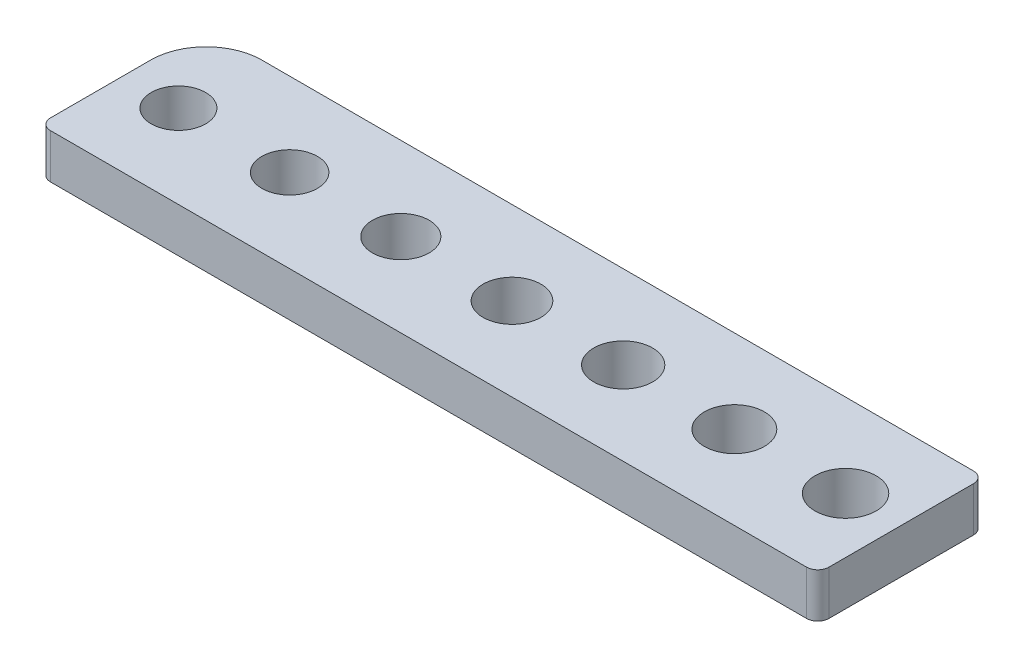
ISO-10303-21;
HEADER;
FILE_DESCRIPTION(('STEP AP214'),'2;1');
FILE_NAME('part.step','',(''),(''),'','','');
FILE_SCHEMA(('AUTOMOTIVE_DESIGN { 1 0 10303 214 1 1 1 1 }'));
ENDSEC;
DATA;
#1=APPLICATION_CONTEXT('core data for automotive mechanical design processes');
#2=APPLICATION_PROTOCOL_DEFINITION('international standard','automotive_design',2000,#1);
#3=PRODUCT_CONTEXT('',#1,'mechanical');
#4=PRODUCT('Part','Part','',(#3));
#5=PRODUCT_RELATED_PRODUCT_CATEGORY('part','',(#4));
#6=PRODUCT_DEFINITION_FORMATION('','',#4);
#7=PRODUCT_DEFINITION_CONTEXT('part definition',#1,'design');
#8=PRODUCT_DEFINITION('design','',#6,#7);
#9=PRODUCT_DEFINITION_SHAPE('','',#8);
#10=(LENGTH_UNIT() NAMED_UNIT(*) SI_UNIT(.MILLI.,.METRE.));
#11=(NAMED_UNIT(*) PLANE_ANGLE_UNIT() SI_UNIT($,.RADIAN.));
#12=(NAMED_UNIT(*) SI_UNIT($,.STERADIAN.) SOLID_ANGLE_UNIT());
#13=UNCERTAINTY_MEASURE_WITH_UNIT(LENGTH_MEASURE(1.E-05),#10,'distance_accuracy_value','');
#14=(GEOMETRIC_REPRESENTATION_CONTEXT(3) GLOBAL_UNCERTAINTY_ASSIGNED_CONTEXT((#13)) GLOBAL_UNIT_ASSIGNED_CONTEXT((#10,
#11,#12)) REPRESENTATION_CONTEXT('',''));
#15=CARTESIAN_POINT('',(0.,0.,0.));
#16=DIRECTION('',(0.,0.,1.));
#17=DIRECTION('',(1.,0.,0.));
#18=AXIS2_PLACEMENT_3D('',#15,#16,#17);
#19=CARTESIAN_POINT('',(0.,4.,0.));
#20=DIRECTION('',(0.,-1.,0.));
#21=DIRECTION('',(0.,0.,-1.));
#22=AXIS2_PLACEMENT_3D('',#19,#20,#21);
#23=PLANE('',#22);
#24=DIRECTION('',(0.,0.,-1.));
#25=VECTOR('',#24,1.);
#26=CARTESIAN_POINT('',(35.,4.,7.5));
#27=LINE('',#26,#25);
#28=CARTESIAN_POINT('',(35.,4.,6.5));
#29=VERTEX_POINT('',#28);
#30=CARTESIAN_POINT('',(35.,4.,-6.5));
#31=VERTEX_POINT('',#30);
#32=EDGE_CURVE('E125',#29,#31,#27,.T.);
#33=ORIENTED_EDGE('',*,*,#32,.T.);
#34=CARTESIAN_POINT('',(34.,4.,-6.5));
#35=DIRECTION('',(0.,-1.,0.));
#36=DIRECTION('',(0.,0.,-1.));
#37=AXIS2_PLACEMENT_3D('',#34,#35,#36);
#38=CIRCLE('',#37,1.);
#39=CARTESIAN_POINT('',(34.,4.,-7.5));
#40=VERTEX_POINT('',#39);
#41=EDGE_CURVE('E150',#31,#40,#38,.F.);
#42=ORIENTED_EDGE('',*,*,#41,.T.);
#43=DIRECTION('',(-1.,0.,0.));
#44=VECTOR('',#43,1.);
#45=CARTESIAN_POINT('',(-35.,4.,-7.5));
#46=LINE('',#45,#44);
#47=CARTESIAN_POINT('',(-30.,4.,-7.5));
#48=VERTEX_POINT('',#47);
#49=EDGE_CURVE('E169',#40,#48,#46,.T.);
#50=ORIENTED_EDGE('',*,*,#49,.T.);
#51=CARTESIAN_POINT('',(-30.,4.,-2.5));
#52=DIRECTION('',(0.,-1.,0.));
#53=DIRECTION('',(0.,0.,-1.));
#54=AXIS2_PLACEMENT_3D('',#51,#52,#53);
#55=CIRCLE('',#54,5.);
#56=CARTESIAN_POINT('',(-35.,4.,-2.5));
#57=VERTEX_POINT('',#56);
#58=EDGE_CURVE('E132',#48,#57,#55,.F.);
#59=ORIENTED_EDGE('',*,*,#58,.T.);
#60=DIRECTION('',(0.,0.,1.));
#61=VECTOR('',#60,1.);
#62=CARTESIAN_POINT('',(-35.,4.,7.5));
#63=LINE('',#62,#61);
#64=CARTESIAN_POINT('',(-35.,4.,6.5));
#65=VERTEX_POINT('',#64);
#66=EDGE_CURVE('E115',#57,#65,#63,.T.);
#67=ORIENTED_EDGE('',*,*,#66,.T.);
#68=CARTESIAN_POINT('',(-34.,4.,6.5));
#69=DIRECTION('',(0.,-1.,0.));
#70=DIRECTION('',(0.,0.,-1.));
#71=AXIS2_PLACEMENT_3D('',#68,#69,#70);
#72=CIRCLE('',#71,1.);
#73=CARTESIAN_POINT('',(-34.,4.,7.5));
#74=VERTEX_POINT('',#73);
#75=EDGE_CURVE('E53',#65,#74,#72,.F.);
#76=ORIENTED_EDGE('',*,*,#75,.T.);
#77=DIRECTION('',(1.,0.,0.));
#78=VECTOR('',#77,1.);
#79=CARTESIAN_POINT('',(-35.,4.,7.5));
#80=LINE('',#79,#78);
#81=CARTESIAN_POINT('',(34.,4.,7.5));
#82=VERTEX_POINT('',#81);
#83=EDGE_CURVE('E116',#74,#82,#80,.T.);
#84=ORIENTED_EDGE('',*,*,#83,.T.);
#85=CARTESIAN_POINT('',(34.,4.,6.5));
#86=DIRECTION('',(0.,-1.,0.));
#87=DIRECTION('',(0.,0.,-1.));
#88=AXIS2_PLACEMENT_3D('',#85,#86,#87);
#89=CIRCLE('',#88,1.);
#90=EDGE_CURVE('E148',#82,#29,#89,.F.);
#91=ORIENTED_EDGE('',*,*,#90,.T.);
#92=EDGE_LOOP('',(#33,#42,#50,#59,#67,#76,#84,#91));
#93=FACE_BOUND('',#92,.T.);
#94=CARTESIAN_POINT('',(-30.,4.,0.));
#95=DIRECTION('',(0.,1.,0.));
#96=DIRECTION('',(0.,0.,1.));
#97=AXIS2_PLACEMENT_3D('',#94,#95,#96);
#98=CIRCLE('',#97,2.45);
#99=CARTESIAN_POINT('',(-30.,4.,2.45));
#100=VERTEX_POINT('',#99);
#101=EDGE_CURVE('E177',#100,#100,#98,.T.);
#102=ORIENTED_EDGE('',*,*,#101,.F.);
#103=EDGE_LOOP('',(#102));
#104=FACE_BOUND('',#103,.T.);
#105=CARTESIAN_POINT('',(-20.,4.,0.));
#106=DIRECTION('',(0.,1.,0.));
#107=DIRECTION('',(0.,0.,1.));
#108=AXIS2_PLACEMENT_3D('',#105,#106,#107);
#109=CIRCLE('',#108,2.5);
#110=CARTESIAN_POINT('',(-20.,4.,2.5));
#111=VERTEX_POINT('',#110);
#112=EDGE_CURVE('E182',#111,#111,#109,.T.);
#113=ORIENTED_EDGE('',*,*,#112,.F.);
#114=EDGE_LOOP('',(#113));
#115=FACE_BOUND('',#114,.T.);
#116=CARTESIAN_POINT('',(-10.,4.,0.));
#117=DIRECTION('',(0.,1.,0.));
#118=DIRECTION('',(0.,0.,1.));
#119=AXIS2_PLACEMENT_3D('',#116,#117,#118);
#120=CIRCLE('',#119,2.55);
#121=CARTESIAN_POINT('',(-10.,4.,2.55));
#122=VERTEX_POINT('',#121);
#123=EDGE_CURVE('E187',#122,#122,#120,.T.);
#124=ORIENTED_EDGE('',*,*,#123,.F.);
#125=EDGE_LOOP('',(#124));
#126=FACE_BOUND('',#125,.T.);
#127=CARTESIAN_POINT('',(0.,4.,0.));
#128=DIRECTION('',(0.,1.,0.));
#129=DIRECTION('',(0.,0.,1.));
#130=AXIS2_PLACEMENT_3D('',#127,#128,#129);
#131=CIRCLE('',#130,2.6);
#132=CARTESIAN_POINT('',(0.,4.,2.6));
#133=VERTEX_POINT('',#132);
#134=EDGE_CURVE('E193',#133,#133,#131,.T.);
#135=ORIENTED_EDGE('',*,*,#134,.F.);
#136=EDGE_LOOP('',(#135));
#137=FACE_BOUND('',#136,.T.);
#138=CARTESIAN_POINT('',(10.,4.,0.));
#139=DIRECTION('',(0.,1.,0.));
#140=DIRECTION('',(0.,0.,1.));
#141=AXIS2_PLACEMENT_3D('',#138,#139,#140);
#142=CIRCLE('',#141,2.65);
#143=CARTESIAN_POINT('',(10.,4.,2.65));
#144=VERTEX_POINT('',#143);
#145=EDGE_CURVE('E199',#144,#144,#142,.T.);
#146=ORIENTED_EDGE('',*,*,#145,.F.);
#147=EDGE_LOOP('',(#146));
#148=FACE_BOUND('',#147,.T.);
#149=CARTESIAN_POINT('',(20.,4.,0.));
#150=DIRECTION('',(0.,1.,0.));
#151=DIRECTION('',(0.,0.,1.));
#152=AXIS2_PLACEMENT_3D('',#149,#150,#151);
#153=CIRCLE('',#152,2.7);
#154=CARTESIAN_POINT('',(20.,4.,2.7));
#155=VERTEX_POINT('',#154);
#156=EDGE_CURVE('E205',#155,#155,#153,.T.);
#157=ORIENTED_EDGE('',*,*,#156,.F.);
#158=EDGE_LOOP('',(#157));
#159=FACE_BOUND('',#158,.T.);
#160=CARTESIAN_POINT('',(30.,4.,0.));
#161=DIRECTION('',(0.,1.,0.));
#162=DIRECTION('',(0.,0.,1.));
#163=AXIS2_PLACEMENT_3D('',#160,#161,#162);
#164=CIRCLE('',#163,2.75);
#165=CARTESIAN_POINT('',(30.,4.,2.75));
#166=VERTEX_POINT('',#165);
#167=EDGE_CURVE('E211',#166,#166,#164,.T.);
#168=ORIENTED_EDGE('',*,*,#167,.F.);
#169=EDGE_LOOP('',(#168));
#170=FACE_BOUND('',#169,.T.);
#171=ADVANCED_FACE('F32',(#93,#104,#115,#126,#137,#148,#159,#170),#23,.F.);
#172=CARTESIAN_POINT('',(0.,0.,0.));
#173=DIRECTION('',(0.,-1.,0.));
#174=DIRECTION('',(0.,0.,-1.));
#175=AXIS2_PLACEMENT_3D('',#172,#173,#174);
#176=PLANE('',#175);
#177=CARTESIAN_POINT('',(20.,0.,0.));
#178=DIRECTION('',(0.,1.,0.));
#179=DIRECTION('',(0.,0.,1.));
#180=AXIS2_PLACEMENT_3D('',#177,#178,#179);
#181=CIRCLE('',#180,2.7);
#182=CARTESIAN_POINT('',(20.,0.,2.7));
#183=VERTEX_POINT('',#182);
#184=EDGE_CURVE('E208',#183,#183,#181,.T.);
#185=ORIENTED_EDGE('',*,*,#184,.T.);
#186=EDGE_LOOP('',(#185));
#187=FACE_BOUND('',#186,.T.);
#188=CARTESIAN_POINT('',(0.,0.,0.));
#189=DIRECTION('',(0.,1.,0.));
#190=DIRECTION('',(0.,0.,1.));
#191=AXIS2_PLACEMENT_3D('',#188,#189,#190);
#192=CIRCLE('',#191,2.6);
#193=CARTESIAN_POINT('',(0.,0.,2.6));
#194=VERTEX_POINT('',#193);
#195=EDGE_CURVE('E196',#194,#194,#192,.T.);
#196=ORIENTED_EDGE('',*,*,#195,.T.);
#197=EDGE_LOOP('',(#196));
#198=FACE_BOUND('',#197,.T.);
#199=CARTESIAN_POINT('',(-20.,0.,0.));
#200=DIRECTION('',(0.,1.,0.));
#201=DIRECTION('',(0.,0.,1.));
#202=AXIS2_PLACEMENT_3D('',#199,#200,#201);
#203=CIRCLE('',#202,2.5);
#204=CARTESIAN_POINT('',(-20.,0.,2.5));
#205=VERTEX_POINT('',#204);
#206=EDGE_CURVE('E184',#205,#205,#203,.T.);
#207=ORIENTED_EDGE('',*,*,#206,.T.);
#208=EDGE_LOOP('',(#207));
#209=FACE_BOUND('',#208,.T.);
#210=DIRECTION('',(-1.,0.,0.));
#211=VECTOR('',#210,1.);
#212=CARTESIAN_POINT('',(-35.,0.,-7.5));
#213=LINE('',#212,#211);
#214=CARTESIAN_POINT('',(34.,0.,-7.5));
#215=VERTEX_POINT('',#214);
#216=CARTESIAN_POINT('',(-30.,0.,-7.5));
#217=VERTEX_POINT('',#216);
#218=EDGE_CURVE('E123',#215,#217,#213,.T.);
#219=ORIENTED_EDGE('',*,*,#218,.F.);
#220=CARTESIAN_POINT('',(34.,0.,-6.5));
#221=DIRECTION('',(0.,-1.,0.));
#222=DIRECTION('',(0.,0.,-1.));
#223=AXIS2_PLACEMENT_3D('',#220,#221,#222);
#224=CIRCLE('',#223,1.);
#225=CARTESIAN_POINT('',(35.,0.,-6.5));
#226=VERTEX_POINT('',#225);
#227=EDGE_CURVE('E140',#215,#226,#224,.T.);
#228=ORIENTED_EDGE('',*,*,#227,.T.);
#229=DIRECTION('',(0.,0.,-1.));
#230=VECTOR('',#229,1.);
#231=CARTESIAN_POINT('',(35.,0.,7.5));
#232=LINE('',#231,#230);
#233=CARTESIAN_POINT('',(35.,0.,6.5));
#234=VERTEX_POINT('',#233);
#235=EDGE_CURVE('E127',#234,#226,#232,.T.);
#236=ORIENTED_EDGE('',*,*,#235,.F.);
#237=CARTESIAN_POINT('',(34.,0.,6.5));
#238=DIRECTION('',(0.,-1.,0.));
#239=DIRECTION('',(0.,0.,-1.));
#240=AXIS2_PLACEMENT_3D('',#237,#238,#239);
#241=CIRCLE('',#240,1.);
#242=CARTESIAN_POINT('',(34.,0.,7.5));
#243=VERTEX_POINT('',#242);
#244=EDGE_CURVE('E138',#234,#243,#241,.T.);
#245=ORIENTED_EDGE('',*,*,#244,.T.);
#246=DIRECTION('',(1.,0.,0.));
#247=VECTOR('',#246,1.);
#248=CARTESIAN_POINT('',(-35.,0.,7.5));
#249=LINE('',#248,#247);
#250=CARTESIAN_POINT('',(-34.,0.,7.5));
#251=VERTEX_POINT('',#250);
#252=EDGE_CURVE('E122',#251,#243,#249,.T.);
#253=ORIENTED_EDGE('',*,*,#252,.F.);
#254=CARTESIAN_POINT('',(-34.,0.,6.5));
#255=DIRECTION('',(0.,-1.,0.));
#256=DIRECTION('',(0.,0.,-1.));
#257=AXIS2_PLACEMENT_3D('',#254,#255,#256);
#258=CIRCLE('',#257,1.);
#259=CARTESIAN_POINT('',(-35.,0.,6.5));
#260=VERTEX_POINT('',#259);
#261=EDGE_CURVE('E121',#251,#260,#258,.T.);
#262=ORIENTED_EDGE('',*,*,#261,.T.);
#263=DIRECTION('',(0.,0.,1.));
#264=VECTOR('',#263,1.);
#265=CARTESIAN_POINT('',(-35.,0.,7.5));
#266=LINE('',#265,#264);
#267=CARTESIAN_POINT('',(-35.,0.,-2.5));
#268=VERTEX_POINT('',#267);
#269=EDGE_CURVE('E113',#268,#260,#266,.T.);
#270=ORIENTED_EDGE('',*,*,#269,.F.);
#271=CARTESIAN_POINT('',(-30.,0.,-2.5));
#272=DIRECTION('',(0.,-1.,0.));
#273=DIRECTION('',(0.,0.,-1.));
#274=AXIS2_PLACEMENT_3D('',#271,#272,#273);
#275=CIRCLE('',#274,5.);
#276=EDGE_CURVE('E98',#268,#217,#275,.T.);
#277=ORIENTED_EDGE('',*,*,#276,.T.);
#278=EDGE_LOOP('',(#219,#228,#236,#245,#253,#262,#270,#277));
#279=FACE_BOUND('',#278,.T.);
#280=CARTESIAN_POINT('',(-30.,0.,0.));
#281=DIRECTION('',(0.,1.,0.));
#282=DIRECTION('',(0.,0.,1.));
#283=AXIS2_PLACEMENT_3D('',#280,#281,#282);
#284=CIRCLE('',#283,2.45);
#285=CARTESIAN_POINT('',(-30.,0.,2.45));
#286=VERTEX_POINT('',#285);
#287=EDGE_CURVE('E173',#286,#286,#284,.T.);
#288=ORIENTED_EDGE('',*,*,#287,.T.);
#289=EDGE_LOOP('',(#288));
#290=FACE_BOUND('',#289,.T.);
#291=CARTESIAN_POINT('',(-10.,0.,0.));
#292=DIRECTION('',(0.,1.,0.));
#293=DIRECTION('',(0.,0.,1.));
#294=AXIS2_PLACEMENT_3D('',#291,#292,#293);
#295=CIRCLE('',#294,2.55);
#296=CARTESIAN_POINT('',(-10.,0.,2.55));
#297=VERTEX_POINT('',#296);
#298=EDGE_CURVE('E190',#297,#297,#295,.T.);
#299=ORIENTED_EDGE('',*,*,#298,.T.);
#300=EDGE_LOOP('',(#299));
#301=FACE_BOUND('',#300,.T.);
#302=CARTESIAN_POINT('',(10.,0.,0.));
#303=DIRECTION('',(0.,1.,0.));
#304=DIRECTION('',(0.,0.,1.));
#305=AXIS2_PLACEMENT_3D('',#302,#303,#304);
#306=CIRCLE('',#305,2.65);
#307=CARTESIAN_POINT('',(10.,0.,2.65));
#308=VERTEX_POINT('',#307);
#309=EDGE_CURVE('E202',#308,#308,#306,.T.);
#310=ORIENTED_EDGE('',*,*,#309,.T.);
#311=EDGE_LOOP('',(#310));
#312=FACE_BOUND('',#311,.T.);
#313=CARTESIAN_POINT('',(30.,0.,0.));
#314=DIRECTION('',(0.,1.,0.));
#315=DIRECTION('',(0.,0.,1.));
#316=AXIS2_PLACEMENT_3D('',#313,#314,#315);
#317=CIRCLE('',#316,2.75);
#318=CARTESIAN_POINT('',(30.,0.,2.75));
#319=VERTEX_POINT('',#318);
#320=EDGE_CURVE('E214',#319,#319,#317,.T.);
#321=ORIENTED_EDGE('',*,*,#320,.T.);
#322=EDGE_LOOP('',(#321));
#323=FACE_BOUND('',#322,.T.);
#324=ADVANCED_FACE('F118',(#187,#198,#209,#279,#290,#301,#312,#323),#176,.T.);
#325=CARTESIAN_POINT('',(35.,4.,7.5));
#326=DIRECTION('',(-1.,0.,0.));
#327=DIRECTION('',(0.,0.,1.));
#328=AXIS2_PLACEMENT_3D('',#325,#326,#327);
#329=PLANE('',#328);
#330=ORIENTED_EDGE('',*,*,#235,.T.);
#331=DIRECTION('',(0.,-1.,0.));
#332=VECTOR('',#331,1.);
#333=CARTESIAN_POINT('',(35.,4.,-6.5));
#334=LINE('',#333,#332);
#335=EDGE_CURVE('E145',#226,#31,#334,.F.);
#336=ORIENTED_EDGE('',*,*,#335,.T.);
#337=ORIENTED_EDGE('',*,*,#32,.F.);
#338=DIRECTION('',(0.,-1.,0.));
#339=VECTOR('',#338,1.);
#340=CARTESIAN_POINT('',(35.,4.,6.5));
#341=LINE('',#340,#339);
#342=EDGE_CURVE('E142',#29,#234,#341,.T.);
#343=ORIENTED_EDGE('',*,*,#342,.T.);
#344=EDGE_LOOP('',(#330,#336,#337,#343));
#345=FACE_BOUND('',#344,.T.);
#346=ADVANCED_FACE('F165',(#345),#329,.F.);
#347=CARTESIAN_POINT('',(-35.,4.,-7.5));
#348=DIRECTION('',(0.,0.,1.));
#349=DIRECTION('',(1.,0.,0.));
#350=AXIS2_PLACEMENT_3D('',#347,#348,#349);
#351=PLANE('',#350);
#352=ORIENTED_EDGE('',*,*,#49,.F.);
#353=DIRECTION('',(0.,-1.,0.));
#354=VECTOR('',#353,1.);
#355=CARTESIAN_POINT('',(34.,4.,-7.5));
#356=LINE('',#355,#354);
#357=EDGE_CURVE('E134',#40,#215,#356,.T.);
#358=ORIENTED_EDGE('',*,*,#357,.T.);
#359=ORIENTED_EDGE('',*,*,#218,.T.);
#360=DIRECTION('',(0.,-1.,0.));
#361=VECTOR('',#360,1.);
#362=CARTESIAN_POINT('',(-30.,4.,-7.5));
#363=LINE('',#362,#361);
#364=EDGE_CURVE('E104',#217,#48,#363,.F.);
#365=ORIENTED_EDGE('',*,*,#364,.T.);
#366=EDGE_LOOP('',(#352,#358,#359,#365));
#367=FACE_BOUND('',#366,.T.);
#368=ADVANCED_FACE('F239',(#367),#351,.F.);
#369=CARTESIAN_POINT('',(-35.,4.,7.5));
#370=DIRECTION('',(1.,0.,0.));
#371=DIRECTION('',(0.,0.,-1.));
#372=AXIS2_PLACEMENT_3D('',#369,#370,#371);
#373=PLANE('',#372);
#374=ORIENTED_EDGE('',*,*,#269,.T.);
#375=DIRECTION('',(0.,-1.,0.));
#376=VECTOR('',#375,1.);
#377=CARTESIAN_POINT('',(-35.,4.,6.5));
#378=LINE('',#377,#376);
#379=EDGE_CURVE('E11',#260,#65,#378,.F.);
#380=ORIENTED_EDGE('',*,*,#379,.T.);
#381=ORIENTED_EDGE('',*,*,#66,.F.);
#382=DIRECTION('',(0.,-1.,0.));
#383=VECTOR('',#382,1.);
#384=CARTESIAN_POINT('',(-35.,4.,-2.5));
#385=LINE('',#384,#383);
#386=EDGE_CURVE('E102',#57,#268,#385,.T.);
#387=ORIENTED_EDGE('',*,*,#386,.T.);
#388=EDGE_LOOP('',(#374,#380,#381,#387));
#389=FACE_BOUND('',#388,.T.);
#390=ADVANCED_FACE('F112',(#389),#373,.F.);
#391=CARTESIAN_POINT('',(-35.,4.,7.5));
#392=DIRECTION('',(0.,0.,-1.));
#393=DIRECTION('',(-1.,0.,0.));
#394=AXIS2_PLACEMENT_3D('',#391,#392,#393);
#395=PLANE('',#394);
#396=ORIENTED_EDGE('',*,*,#252,.T.);
#397=DIRECTION('',(0.,-1.,0.));
#398=VECTOR('',#397,1.);
#399=CARTESIAN_POINT('',(34.,4.,7.5));
#400=LINE('',#399,#398);
#401=EDGE_CURVE('E40',#243,#82,#400,.F.);
#402=ORIENTED_EDGE('',*,*,#401,.T.);
#403=ORIENTED_EDGE('',*,*,#83,.F.);
#404=DIRECTION('',(0.,-1.,0.));
#405=VECTOR('',#404,1.);
#406=CARTESIAN_POINT('',(-34.,4.,7.5));
#407=LINE('',#406,#405);
#408=EDGE_CURVE('E152',#74,#251,#407,.T.);
#409=ORIENTED_EDGE('',*,*,#408,.T.);
#410=EDGE_LOOP('',(#396,#402,#403,#409));
#411=FACE_BOUND('',#410,.T.);
#412=ADVANCED_FACE('F155',(#411),#395,.F.);
#413=CARTESIAN_POINT('',(-30.,4.,0.));
#414=DIRECTION('',(0.,-1.,0.));
#415=DIRECTION('',(0.,0.,-1.));
#416=AXIS2_PLACEMENT_3D('',#413,#414,#415);
#417=CYLINDRICAL_SURFACE('',#416,2.45);
#418=ORIENTED_EDGE('',*,*,#101,.T.);
#419=EDGE_LOOP('',(#418));
#420=FACE_BOUND('',#419,.T.);
#421=ORIENTED_EDGE('',*,*,#287,.F.);
#422=EDGE_LOOP('',(#421));
#423=FACE_BOUND('',#422,.T.);
#424=ADVANCED_FACE('F232',(#420,#423),#417,.F.);
#425=CARTESIAN_POINT('',(-20.,4.,0.));
#426=DIRECTION('',(0.,-1.,0.));
#427=DIRECTION('',(0.,0.,-1.));
#428=AXIS2_PLACEMENT_3D('',#425,#426,#427);
#429=CYLINDRICAL_SURFACE('',#428,2.5);
#430=ORIENTED_EDGE('',*,*,#112,.T.);
#431=EDGE_LOOP('',(#430));
#432=FACE_BOUND('',#431,.T.);
#433=ORIENTED_EDGE('',*,*,#206,.F.);
#434=EDGE_LOOP('',(#433));
#435=FACE_BOUND('',#434,.T.);
#436=ADVANCED_FACE('F358',(#432,#435),#429,.F.);
#437=CARTESIAN_POINT('',(-10.,4.,0.));
#438=DIRECTION('',(0.,-1.,0.));
#439=DIRECTION('',(0.,0.,-1.));
#440=AXIS2_PLACEMENT_3D('',#437,#438,#439);
#441=CYLINDRICAL_SURFACE('',#440,2.55);
#442=ORIENTED_EDGE('',*,*,#123,.T.);
#443=EDGE_LOOP('',(#442));
#444=FACE_BOUND('',#443,.T.);
#445=ORIENTED_EDGE('',*,*,#298,.F.);
#446=EDGE_LOOP('',(#445));
#447=FACE_BOUND('',#446,.T.);
#448=ADVANCED_FACE('F348',(#444,#447),#441,.F.);
#449=CARTESIAN_POINT('',(0.,4.,0.));
#450=DIRECTION('',(0.,-1.,0.));
#451=DIRECTION('',(0.,0.,-1.));
#452=AXIS2_PLACEMENT_3D('',#449,#450,#451);
#453=CYLINDRICAL_SURFACE('',#452,2.6);
#454=ORIENTED_EDGE('',*,*,#134,.T.);
#455=EDGE_LOOP('',(#454));
#456=FACE_BOUND('',#455,.T.);
#457=ORIENTED_EDGE('',*,*,#195,.F.);
#458=EDGE_LOOP('',(#457));
#459=FACE_BOUND('',#458,.T.);
#460=ADVANCED_FACE('F338',(#456,#459),#453,.F.);
#461=CARTESIAN_POINT('',(10.,4.,0.));
#462=DIRECTION('',(0.,-1.,0.));
#463=DIRECTION('',(0.,0.,-1.));
#464=AXIS2_PLACEMENT_3D('',#461,#462,#463);
#465=CYLINDRICAL_SURFACE('',#464,2.65);
#466=ORIENTED_EDGE('',*,*,#145,.T.);
#467=EDGE_LOOP('',(#466));
#468=FACE_BOUND('',#467,.T.);
#469=ORIENTED_EDGE('',*,*,#309,.F.);
#470=EDGE_LOOP('',(#469));
#471=FACE_BOUND('',#470,.T.);
#472=ADVANCED_FACE('F328',(#468,#471),#465,.F.);
#473=CARTESIAN_POINT('',(20.,4.,0.));
#474=DIRECTION('',(0.,-1.,0.));
#475=DIRECTION('',(0.,0.,-1.));
#476=AXIS2_PLACEMENT_3D('',#473,#474,#475);
#477=CYLINDRICAL_SURFACE('',#476,2.7);
#478=ORIENTED_EDGE('',*,*,#156,.T.);
#479=EDGE_LOOP('',(#478));
#480=FACE_BOUND('',#479,.T.);
#481=ORIENTED_EDGE('',*,*,#184,.F.);
#482=EDGE_LOOP('',(#481));
#483=FACE_BOUND('',#482,.T.);
#484=ADVANCED_FACE('F319',(#480,#483),#477,.F.);
#485=CARTESIAN_POINT('',(30.,4.,0.));
#486=DIRECTION('',(0.,-1.,0.));
#487=DIRECTION('',(0.,0.,-1.));
#488=AXIS2_PLACEMENT_3D('',#485,#486,#487);
#489=CYLINDRICAL_SURFACE('',#488,2.75);
#490=ORIENTED_EDGE('',*,*,#167,.T.);
#491=EDGE_LOOP('',(#490));
#492=FACE_BOUND('',#491,.T.);
#493=ORIENTED_EDGE('',*,*,#320,.F.);
#494=EDGE_LOOP('',(#493));
#495=FACE_BOUND('',#494,.T.);
#496=ADVANCED_FACE('F220',(#492,#495),#489,.F.);
#497=CARTESIAN_POINT('',(-30.,4.,-2.5));
#498=DIRECTION('',(0.,-1.,0.));
#499=DIRECTION('',(0.,0.,-1.));
#500=AXIS2_PLACEMENT_3D('',#497,#498,#499);
#501=CYLINDRICAL_SURFACE('',#500,5.);
#502=ORIENTED_EDGE('',*,*,#58,.F.);
#503=ORIENTED_EDGE('',*,*,#364,.F.);
#504=ORIENTED_EDGE('',*,*,#276,.F.);
#505=ORIENTED_EDGE('',*,*,#386,.F.);
#506=EDGE_LOOP('',(#502,#503,#504,#505));
#507=FACE_BOUND('',#506,.T.);
#508=ADVANCED_FACE('F101',(#507),#501,.T.);
#509=CARTESIAN_POINT('',(34.,4.,-6.5));
#510=DIRECTION('',(0.,-1.,0.));
#511=DIRECTION('',(0.,0.,-1.));
#512=AXIS2_PLACEMENT_3D('',#509,#510,#511);
#513=CYLINDRICAL_SURFACE('',#512,1.);
#514=ORIENTED_EDGE('',*,*,#41,.F.);
#515=ORIENTED_EDGE('',*,*,#335,.F.);
#516=ORIENTED_EDGE('',*,*,#227,.F.);
#517=ORIENTED_EDGE('',*,*,#357,.F.);
#518=EDGE_LOOP('',(#514,#515,#516,#517));
#519=FACE_BOUND('',#518,.T.);
#520=ADVANCED_FACE('F247',(#519),#513,.T.);
#521=CARTESIAN_POINT('',(34.,4.,6.5));
#522=DIRECTION('',(0.,-1.,0.));
#523=DIRECTION('',(0.,0.,-1.));
#524=AXIS2_PLACEMENT_3D('',#521,#522,#523);
#525=CYLINDRICAL_SURFACE('',#524,1.);
#526=ORIENTED_EDGE('',*,*,#90,.F.);
#527=ORIENTED_EDGE('',*,*,#401,.F.);
#528=ORIENTED_EDGE('',*,*,#244,.F.);
#529=ORIENTED_EDGE('',*,*,#342,.F.);
#530=EDGE_LOOP('',(#526,#527,#528,#529));
#531=FACE_BOUND('',#530,.T.);
#532=ADVANCED_FACE('F162',(#531),#525,.T.);
#533=CARTESIAN_POINT('',(-34.,4.,6.5));
#534=DIRECTION('',(0.,-1.,0.));
#535=DIRECTION('',(0.,0.,-1.));
#536=AXIS2_PLACEMENT_3D('',#533,#534,#535);
#537=CYLINDRICAL_SURFACE('',#536,1.);
#538=ORIENTED_EDGE('',*,*,#75,.F.);
#539=ORIENTED_EDGE('',*,*,#379,.F.);
#540=ORIENTED_EDGE('',*,*,#261,.F.);
#541=ORIENTED_EDGE('',*,*,#408,.F.);
#542=EDGE_LOOP('',(#538,#539,#540,#541));
#543=FACE_BOUND('',#542,.T.);
#544=ADVANCED_FACE('F34',(#543),#537,.T.);
#545=CLOSED_SHELL('',(#171,#324,#346,#368,#390,#412,#424,#436,#448,#460,#472,#484,#496,#508,
#520,#532,#544));
#546=MANIFOLD_SOLID_BREP('B2',#545);
#547=ADVANCED_BREP_SHAPE_REPRESENTATION('',(#18,#546),#14);
#548=SHAPE_DEFINITION_REPRESENTATION(#9,#547);
ENDSEC;
END-ISO-10303-21;
